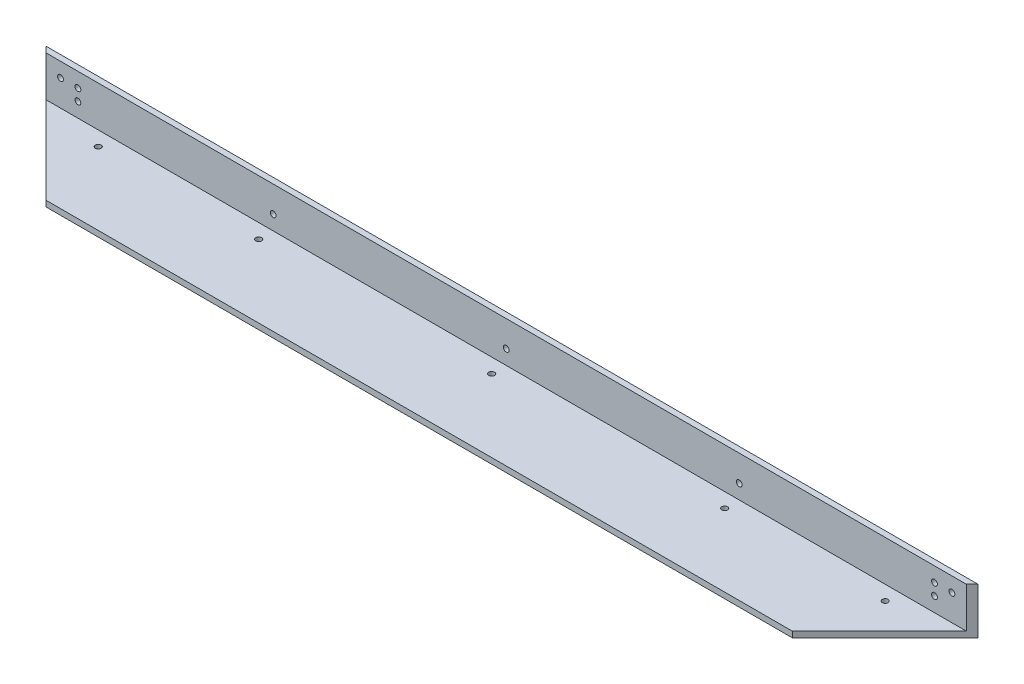
ISO-10303-21;
HEADER;
FILE_DESCRIPTION(('STEP AP214'),'2;1');
FILE_NAME('part.step','',(''),(''),'','','');
FILE_SCHEMA(('AUTOMOTIVE_DESIGN { 1 0 10303 214 1 1 1 1 }'));
ENDSEC;
DATA;
#1=APPLICATION_CONTEXT('core data for automotive mechanical design processes');
#2=APPLICATION_PROTOCOL_DEFINITION('international standard','automotive_design',2000,#1);
#3=PRODUCT_CONTEXT('',#1,'mechanical');
#4=PRODUCT('Part','Part','',(#3));
#5=PRODUCT_RELATED_PRODUCT_CATEGORY('part','',(#4));
#6=PRODUCT_DEFINITION_FORMATION('','',#4);
#7=PRODUCT_DEFINITION_CONTEXT('part definition',#1,'design');
#8=PRODUCT_DEFINITION('design','',#6,#7);
#9=PRODUCT_DEFINITION_SHAPE('','',#8);
#10=(LENGTH_UNIT() NAMED_UNIT(*) SI_UNIT(.MILLI.,.METRE.));
#11=(NAMED_UNIT(*) PLANE_ANGLE_UNIT() SI_UNIT($,.RADIAN.));
#12=(NAMED_UNIT(*) SI_UNIT($,.STERADIAN.) SOLID_ANGLE_UNIT());
#13=UNCERTAINTY_MEASURE_WITH_UNIT(LENGTH_MEASURE(1.E-05),#10,'distance_accuracy_value','');
#14=(GEOMETRIC_REPRESENTATION_CONTEXT(3) GLOBAL_UNCERTAINTY_ASSIGNED_CONTEXT((#13)) GLOBAL_UNIT_ASSIGNED_CONTEXT((#10,
#11,#12)) REPRESENTATION_CONTEXT('',''));
#15=CARTESIAN_POINT('',(0.,0.,0.));
#16=DIRECTION('',(0.,0.,1.));
#17=DIRECTION('',(1.,0.,0.));
#18=AXIS2_PLACEMENT_3D('',#15,#16,#17);
#19=CARTESIAN_POINT('',(510.,25.4,0.));
#20=DIRECTION('',(0.,0.,1.));
#21=DIRECTION('',(0.,-1.,0.));
#22=AXIS2_PLACEMENT_3D('',#19,#20,#21);
#23=PLANE('',#22);
#24=CARTESIAN_POINT('',(498.8875,17.4625,0.));
#25=DIRECTION('',(0.,0.,-1.));
#26=DIRECTION('',(0.,1.,0.));
#27=AXIS2_PLACEMENT_3D('',#24,#25,#26);
#28=CIRCLE('',#27,1.58750000000004);
#29=CARTESIAN_POINT('',(498.8875,19.05,0.));
#30=VERTEX_POINT('',#29);
#31=EDGE_CURVE('E153',#30,#30,#28,.T.);
#32=ORIENTED_EDGE('',*,*,#31,.F.);
#33=EDGE_LOOP('',(#32));
#34=FACE_BOUND('',#33,.T.);
#35=CARTESIAN_POINT('',(127.5,11.1125,0.));
#36=DIRECTION('',(0.,0.,-1.));
#37=DIRECTION('',(0.,1.,0.));
#38=AXIS2_PLACEMENT_3D('',#35,#36,#37);
#39=CIRCLE('',#38,1.58749999999999);
#40=CARTESIAN_POINT('',(127.5,12.7,0.));
#41=VERTEX_POINT('',#40);
#42=EDGE_CURVE('E332',#41,#41,#39,.T.);
#43=ORIENTED_EDGE('',*,*,#42,.F.);
#44=EDGE_LOOP('',(#43));
#45=FACE_BOUND('',#44,.T.);
#46=CARTESIAN_POINT('',(255.,11.1125,0.));
#47=DIRECTION('',(0.,0.,-1.));
#48=DIRECTION('',(0.,1.,0.));
#49=AXIS2_PLACEMENT_3D('',#46,#47,#48);
#50=CIRCLE('',#49,1.58750000000004);
#51=CARTESIAN_POINT('',(255.,12.7,0.));
#52=VERTEX_POINT('',#51);
#53=EDGE_CURVE('E335',#52,#52,#50,.T.);
#54=ORIENTED_EDGE('',*,*,#53,.F.);
#55=EDGE_LOOP('',(#54));
#56=FACE_BOUND('',#55,.T.);
#57=CARTESIAN_POINT('',(382.5,11.1125,0.));
#58=DIRECTION('',(0.,0.,-1.));
#59=DIRECTION('',(0.,1.,0.));
#60=AXIS2_PLACEMENT_3D('',#57,#58,#59);
#61=CIRCLE('',#60,1.58750000000004);
#62=CARTESIAN_POINT('',(382.5,12.7,0.));
#63=VERTEX_POINT('',#62);
#64=EDGE_CURVE('E338',#63,#63,#61,.T.);
#65=ORIENTED_EDGE('',*,*,#64,.F.);
#66=EDGE_LOOP('',(#65));
#67=FACE_BOUND('',#66,.T.);
#68=CARTESIAN_POINT('',(489.3625,11.1125,0.));
#69=DIRECTION('',(0.,0.,-1.));
#70=DIRECTION('',(0.,1.,0.));
#71=AXIS2_PLACEMENT_3D('',#68,#69,#70);
#72=CIRCLE('',#71,1.58749999999992);
#73=CARTESIAN_POINT('',(489.3625,12.6999999999999,0.));
#74=VERTEX_POINT('',#73);
#75=EDGE_CURVE('E330',#74,#74,#72,.T.);
#76=ORIENTED_EDGE('',*,*,#75,.F.);
#77=EDGE_LOOP('',(#76));
#78=FACE_BOUND('',#77,.T.);
#79=CARTESIAN_POINT('',(489.3625,17.4625,0.));
#80=DIRECTION('',(0.,0.,-1.));
#81=DIRECTION('',(0.,1.,0.));
#82=AXIS2_PLACEMENT_3D('',#79,#80,#81);
#83=CIRCLE('',#82,1.58749999999992);
#84=CARTESIAN_POINT('',(489.3625,19.0499999999999,0.));
#85=VERTEX_POINT('',#84);
#86=EDGE_CURVE('E317',#85,#85,#83,.T.);
#87=ORIENTED_EDGE('',*,*,#86,.F.);
#88=EDGE_LOOP('',(#87));
#89=FACE_BOUND('',#88,.T.);
#90=CARTESIAN_POINT('',(20.6375,17.4625,0.));
#91=DIRECTION('',(0.,0.,-1.));
#92=DIRECTION('',(0.,1.,0.));
#93=AXIS2_PLACEMENT_3D('',#90,#91,#92);
#94=CIRCLE('',#93,1.5875);
#95=CARTESIAN_POINT('',(20.6375,19.05,0.));
#96=VERTEX_POINT('',#95);
#97=EDGE_CURVE('E319',#96,#96,#94,.T.);
#98=ORIENTED_EDGE('',*,*,#97,.F.);
#99=EDGE_LOOP('',(#98));
#100=FACE_BOUND('',#99,.T.);
#101=CARTESIAN_POINT('',(11.1125,17.4625,0.));
#102=DIRECTION('',(0.,0.,-1.));
#103=DIRECTION('',(0.,1.,0.));
#104=AXIS2_PLACEMENT_3D('',#101,#102,#103);
#105=CIRCLE('',#104,1.5875);
#106=CARTESIAN_POINT('',(11.1125,19.05,0.));
#107=VERTEX_POINT('',#106);
#108=EDGE_CURVE('E324',#107,#107,#105,.T.);
#109=ORIENTED_EDGE('',*,*,#108,.F.);
#110=EDGE_LOOP('',(#109));
#111=FACE_BOUND('',#110,.T.);
#112=CARTESIAN_POINT('',(20.6375,11.1125,0.));
#113=DIRECTION('',(0.,0.,-1.));
#114=DIRECTION('',(0.,1.,0.));
#115=AXIS2_PLACEMENT_3D('',#112,#113,#114);
#116=CIRCLE('',#115,1.5875);
#117=CARTESIAN_POINT('',(20.6375,12.7,0.));
#118=VERTEX_POINT('',#117);
#119=EDGE_CURVE('E327',#118,#118,#116,.T.);
#120=ORIENTED_EDGE('',*,*,#119,.F.);
#121=EDGE_LOOP('',(#120));
#122=FACE_BOUND('',#121,.T.);
#123=DIRECTION('',(0.,1.,0.));
#124=VECTOR('',#123,1.);
#125=CARTESIAN_POINT('',(0.,25.4,0.));
#126=LINE('',#125,#124);
#127=CARTESIAN_POINT('',(0.,0.,0.));
#128=VERTEX_POINT('',#127);
#129=CARTESIAN_POINT('',(0.,25.4,0.));
#130=VERTEX_POINT('',#129);
#131=EDGE_CURVE('E113',#128,#130,#126,.T.);
#132=ORIENTED_EDGE('',*,*,#131,.T.);
#133=DIRECTION('',(-1.,0.,0.));
#134=VECTOR('',#133,1.);
#135=CARTESIAN_POINT('',(510.,25.4,0.));
#136=LINE('',#135,#134);
#137=CARTESIAN_POINT('',(510.,25.4,0.));
#138=VERTEX_POINT('',#137);
#139=EDGE_CURVE('E99',#138,#130,#136,.T.);
#140=ORIENTED_EDGE('',*,*,#139,.F.);
#141=DIRECTION('',(0.,1.,0.));
#142=VECTOR('',#141,1.);
#143=CARTESIAN_POINT('',(510.,25.4,0.));
#144=LINE('',#143,#142);
#145=CARTESIAN_POINT('',(510.,0.,0.));
#146=VERTEX_POINT('',#145);
#147=EDGE_CURVE('E111',#146,#138,#144,.T.);
#148=ORIENTED_EDGE('',*,*,#147,.F.);
#149=DIRECTION('',(-1.,0.,0.));
#150=VECTOR('',#149,1.);
#151=CARTESIAN_POINT('',(510.,0.,0.));
#152=LINE('',#151,#150);
#153=EDGE_CURVE('E120',#146,#128,#152,.T.);
#154=ORIENTED_EDGE('',*,*,#153,.T.);
#155=EDGE_LOOP('',(#132,#140,#148,#154));
#156=FACE_BOUND('',#155,.T.);
#157=ADVANCED_FACE('F42',(#34,#45,#56,#67,#78,#89,#100,#111,#122,#156),#23,.F.);
#158=CARTESIAN_POINT('',(510.,25.4,3.17499999999997));
#159=DIRECTION('',(0.,-1.,0.));
#160=DIRECTION('',(0.,0.,-1.));
#161=AXIS2_PLACEMENT_3D('',#158,#159,#160);
#162=PLANE('',#161);
#163=ORIENTED_EDGE('',*,*,#139,.T.);
#164=DIRECTION('',(0.707106781186546,0.,0.707106781186549));
#165=VECTOR('',#164,1.);
#166=CARTESIAN_POINT('',(50.8,25.3999999999999,50.8));
#167=LINE('',#166,#165);
#168=CARTESIAN_POINT('',(3.17500000000004,25.4,3.17499999999997));
#169=VERTEX_POINT('',#168);
#170=EDGE_CURVE('E67',#130,#169,#167,.T.);
#171=ORIENTED_EDGE('',*,*,#170,.T.);
#172=DIRECTION('',(-1.,0.,0.));
#173=VECTOR('',#172,1.);
#174=CARTESIAN_POINT('',(510.,25.4,3.17499999999997));
#175=LINE('',#174,#173);
#176=CARTESIAN_POINT('',(506.825,25.4,3.17499999999997));
#177=VERTEX_POINT('',#176);
#178=EDGE_CURVE('E101',#177,#169,#175,.T.);
#179=ORIENTED_EDGE('',*,*,#178,.F.);
#180=DIRECTION('',(-0.707106781186549,0.,0.707106781186546));
#181=VECTOR('',#180,1.);
#182=CARTESIAN_POINT('',(510.,25.4,0.));
#183=LINE('',#182,#181);
#184=EDGE_CURVE('E96',#177,#138,#183,.F.);
#185=ORIENTED_EDGE('',*,*,#184,.T.);
#186=EDGE_LOOP('',(#163,#171,#179,#185));
#187=FACE_BOUND('',#186,.T.);
#188=ADVANCED_FACE('F98',(#187),#162,.F.);
#189=CARTESIAN_POINT('',(510.,3.17499999999996,3.175));
#190=DIRECTION('',(0.,0.,-1.));
#191=DIRECTION('',(0.,1.,0.));
#192=AXIS2_PLACEMENT_3D('',#189,#190,#191);
#193=PLANE('',#192);
#194=CARTESIAN_POINT('',(498.8875,17.4625,3.17499999999998));
#195=DIRECTION('',(0.,0.,-1.));
#196=DIRECTION('',(0.,1.,0.));
#197=AXIS2_PLACEMENT_3D('',#194,#195,#196);
#198=CIRCLE('',#197,1.58750000000004);
#199=CARTESIAN_POINT('',(498.8875,19.0500000000001,3.17499999999998));
#200=VERTEX_POINT('',#199);
#201=EDGE_CURVE('E47',#200,#200,#198,.T.);
#202=ORIENTED_EDGE('',*,*,#201,.T.);
#203=EDGE_LOOP('',(#202));
#204=FACE_BOUND('',#203,.T.);
#205=CARTESIAN_POINT('',(127.5,11.1125,3.17499999999999));
#206=DIRECTION('',(0.,0.,-1.));
#207=DIRECTION('',(0.,1.,0.));
#208=AXIS2_PLACEMENT_3D('',#205,#206,#207);
#209=CIRCLE('',#208,1.58749999999999);
#210=CARTESIAN_POINT('',(127.5,12.7,3.17499999999999));
#211=VERTEX_POINT('',#210);
#212=EDGE_CURVE('E170',#211,#211,#209,.T.);
#213=ORIENTED_EDGE('',*,*,#212,.T.);
#214=EDGE_LOOP('',(#213));
#215=FACE_BOUND('',#214,.T.);
#216=CARTESIAN_POINT('',(255.,11.1125,3.17499999999999));
#217=DIRECTION('',(0.,0.,-1.));
#218=DIRECTION('',(0.,1.,0.));
#219=AXIS2_PLACEMENT_3D('',#216,#217,#218);
#220=CIRCLE('',#219,1.58750000000004);
#221=CARTESIAN_POINT('',(255.,12.7,3.17499999999999));
#222=VERTEX_POINT('',#221);
#223=EDGE_CURVE('E168',#222,#222,#220,.T.);
#224=ORIENTED_EDGE('',*,*,#223,.T.);
#225=EDGE_LOOP('',(#224));
#226=FACE_BOUND('',#225,.T.);
#227=CARTESIAN_POINT('',(382.5,11.1125,3.17499999999999));
#228=DIRECTION('',(0.,0.,-1.));
#229=DIRECTION('',(0.,1.,0.));
#230=AXIS2_PLACEMENT_3D('',#227,#228,#229);
#231=CIRCLE('',#230,1.58750000000004);
#232=CARTESIAN_POINT('',(382.5,12.7,3.17499999999999));
#233=VERTEX_POINT('',#232);
#234=EDGE_CURVE('E165',#233,#233,#231,.T.);
#235=ORIENTED_EDGE('',*,*,#234,.T.);
#236=EDGE_LOOP('',(#235));
#237=FACE_BOUND('',#236,.T.);
#238=CARTESIAN_POINT('',(489.3625,11.1125,3.17499999999999));
#239=DIRECTION('',(0.,0.,-1.));
#240=DIRECTION('',(0.,1.,0.));
#241=AXIS2_PLACEMENT_3D('',#238,#239,#240);
#242=CIRCLE('',#241,1.58749999999992);
#243=CARTESIAN_POINT('',(489.3625,12.6999999999999,3.17499999999999));
#244=VERTEX_POINT('',#243);
#245=EDGE_CURVE('E162',#244,#244,#242,.T.);
#246=ORIENTED_EDGE('',*,*,#245,.T.);
#247=EDGE_LOOP('',(#246));
#248=FACE_BOUND('',#247,.T.);
#249=CARTESIAN_POINT('',(489.3625,17.4625,3.17499999999998));
#250=DIRECTION('',(0.,0.,-1.));
#251=DIRECTION('',(0.,1.,0.));
#252=AXIS2_PLACEMENT_3D('',#249,#250,#251);
#253=CIRCLE('',#252,1.58749999999992);
#254=CARTESIAN_POINT('',(489.3625,19.0499999999999,3.17499999999998));
#255=VERTEX_POINT('',#254);
#256=EDGE_CURVE('E159',#255,#255,#253,.T.);
#257=ORIENTED_EDGE('',*,*,#256,.T.);
#258=EDGE_LOOP('',(#257));
#259=FACE_BOUND('',#258,.T.);
#260=CARTESIAN_POINT('',(20.6375,17.4625,3.17499999999998));
#261=DIRECTION('',(0.,0.,-1.));
#262=DIRECTION('',(0.,1.,0.));
#263=AXIS2_PLACEMENT_3D('',#260,#261,#262);
#264=CIRCLE('',#263,1.5875);
#265=CARTESIAN_POINT('',(20.6375,19.05,3.17499999999998));
#266=VERTEX_POINT('',#265);
#267=EDGE_CURVE('E156',#266,#266,#264,.T.);
#268=ORIENTED_EDGE('',*,*,#267,.T.);
#269=EDGE_LOOP('',(#268));
#270=FACE_BOUND('',#269,.T.);
#271=CARTESIAN_POINT('',(11.1125,17.4625,3.17499999999998));
#272=DIRECTION('',(0.,0.,-1.));
#273=DIRECTION('',(0.,1.,0.));
#274=AXIS2_PLACEMENT_3D('',#271,#272,#273);
#275=CIRCLE('',#274,1.5875);
#276=CARTESIAN_POINT('',(11.1125,19.05,3.17499999999998));
#277=VERTEX_POINT('',#276);
#278=EDGE_CURVE('E152',#277,#277,#275,.T.);
#279=ORIENTED_EDGE('',*,*,#278,.T.);
#280=EDGE_LOOP('',(#279));
#281=FACE_BOUND('',#280,.T.);
#282=CARTESIAN_POINT('',(20.6375,11.1125,3.17499999999999));
#283=DIRECTION('',(0.,0.,-1.));
#284=DIRECTION('',(0.,1.,0.));
#285=AXIS2_PLACEMENT_3D('',#282,#283,#284);
#286=CIRCLE('',#285,1.5875);
#287=CARTESIAN_POINT('',(20.6375,12.7,3.17499999999999));
#288=VERTEX_POINT('',#287);
#289=EDGE_CURVE('E149',#288,#288,#286,.T.);
#290=ORIENTED_EDGE('',*,*,#289,.T.);
#291=EDGE_LOOP('',(#290));
#292=FACE_BOUND('',#291,.T.);
#293=ORIENTED_EDGE('',*,*,#178,.T.);
#294=DIRECTION('',(0.,-1.,0.));
#295=VECTOR('',#294,1.);
#296=CARTESIAN_POINT('',(3.17500000000015,-1.48161216195721E-13,3.17500000000001));
#297=LINE('',#296,#295);
#298=CARTESIAN_POINT('',(3.17500000000015,3.17499999999996,3.175));
#299=VERTEX_POINT('',#298);
#300=EDGE_CURVE('E52',#169,#299,#297,.T.);
#301=ORIENTED_EDGE('',*,*,#300,.T.);
#302=DIRECTION('',(-1.,0.,0.));
#303=VECTOR('',#302,1.);
#304=CARTESIAN_POINT('',(510.,3.17499999999996,3.175));
#305=LINE('',#304,#303);
#306=CARTESIAN_POINT('',(506.825,3.17499999999996,3.175));
#307=VERTEX_POINT('',#306);
#308=EDGE_CURVE('E134',#307,#299,#305,.T.);
#309=ORIENTED_EDGE('',*,*,#308,.F.);
#310=DIRECTION('',(0.,-1.,0.));
#311=VECTOR('',#310,1.);
#312=CARTESIAN_POINT('',(506.825,0.,3.17500000000001));
#313=LINE('',#312,#311);
#314=EDGE_CURVE('E106',#307,#177,#313,.F.);
#315=ORIENTED_EDGE('',*,*,#314,.T.);
#316=EDGE_LOOP('',(#293,#301,#309,#315));
#317=FACE_BOUND('',#316,.T.);
#318=ADVANCED_FACE('F235',(#204,#215,#226,#237,#248,#259,#270,#281,#292,#317),#193,.F.);
#319=CARTESIAN_POINT('',(510.,3.17499999999996,50.8));
#320=DIRECTION('',(0.,-1.,0.));
#321=DIRECTION('',(0.,0.,-1.));
#322=AXIS2_PLACEMENT_3D('',#319,#320,#321);
#323=PLANE('',#322);
#324=CARTESIAN_POINT('',(39.6875,3.17499999999997,11.1125));
#325=DIRECTION('',(0.,-1.,0.));
#326=DIRECTION('',(0.,0.,-1.));
#327=AXIS2_PLACEMENT_3D('',#324,#325,#326);
#328=CIRCLE('',#327,1.5875);
#329=CARTESIAN_POINT('',(39.6875,3.17499999999997,9.525));
#330=VERTEX_POINT('',#329);
#331=EDGE_CURVE('E124',#330,#330,#328,.T.);
#332=ORIENTED_EDGE('',*,*,#331,.T.);
#333=EDGE_LOOP('',(#332));
#334=FACE_BOUND('',#333,.T.);
#335=CARTESIAN_POINT('',(382.5,3.17499999999997,11.1125));
#336=DIRECTION('',(0.,-1.,0.));
#337=DIRECTION('',(0.,0.,-1.));
#338=AXIS2_PLACEMENT_3D('',#335,#336,#337);
#339=CIRCLE('',#338,1.58750000000004);
#340=CARTESIAN_POINT('',(382.5,3.17499999999997,9.52499999999996));
#341=VERTEX_POINT('',#340);
#342=EDGE_CURVE('E202',#341,#341,#339,.T.);
#343=ORIENTED_EDGE('',*,*,#342,.T.);
#344=EDGE_LOOP('',(#343));
#345=FACE_BOUND('',#344,.T.);
#346=CARTESIAN_POINT('',(255.,3.17499999999997,11.1125));
#347=DIRECTION('',(0.,-1.,0.));
#348=DIRECTION('',(0.,0.,-1.));
#349=AXIS2_PLACEMENT_3D('',#346,#347,#348);
#350=CIRCLE('',#349,1.58750000000004);
#351=CARTESIAN_POINT('',(255.,3.17499999999997,9.52499999999996));
#352=VERTEX_POINT('',#351);
#353=EDGE_CURVE('E200',#352,#352,#350,.T.);
#354=ORIENTED_EDGE('',*,*,#353,.T.);
#355=EDGE_LOOP('',(#354));
#356=FACE_BOUND('',#355,.T.);
#357=CARTESIAN_POINT('',(127.5,3.17499999999997,11.1125));
#358=DIRECTION('',(0.,-1.,0.));
#359=DIRECTION('',(0.,0.,-1.));
#360=AXIS2_PLACEMENT_3D('',#357,#358,#359);
#361=CIRCLE('',#360,1.58749999999999);
#362=CARTESIAN_POINT('',(127.5,3.17499999999997,9.52500000000002));
#363=VERTEX_POINT('',#362);
#364=EDGE_CURVE('E197',#363,#363,#361,.T.);
#365=ORIENTED_EDGE('',*,*,#364,.T.);
#366=EDGE_LOOP('',(#365));
#367=FACE_BOUND('',#366,.T.);
#368=CARTESIAN_POINT('',(470.3125,3.17499999999997,11.1125));
#369=DIRECTION('',(0.,-1.,0.));
#370=DIRECTION('',(0.,0.,-1.));
#371=AXIS2_PLACEMENT_3D('',#368,#369,#370);
#372=CIRCLE('',#371,1.58750000000004);
#373=CARTESIAN_POINT('',(470.3125,3.17499999999997,9.52499999999996));
#374=VERTEX_POINT('',#373);
#375=EDGE_CURVE('E194',#374,#374,#372,.T.);
#376=ORIENTED_EDGE('',*,*,#375,.T.);
#377=EDGE_LOOP('',(#376));
#378=FACE_BOUND('',#377,.T.);
#379=ORIENTED_EDGE('',*,*,#308,.T.);
#380=DIRECTION('',(0.707106781186546,0.,0.707106781186549));
#381=VECTOR('',#380,1.);
#382=CARTESIAN_POINT('',(50.8,3.17499999999996,50.8));
#383=LINE('',#382,#381);
#384=CARTESIAN_POINT('',(50.8,3.17499999999996,50.8));
#385=VERTEX_POINT('',#384);
#386=EDGE_CURVE('E11',#299,#385,#383,.T.);
#387=ORIENTED_EDGE('',*,*,#386,.T.);
#388=DIRECTION('',(-1.,0.,0.));
#389=VECTOR('',#388,1.);
#390=CARTESIAN_POINT('',(510.,3.17499999999996,50.8));
#391=LINE('',#390,#389);
#392=CARTESIAN_POINT('',(459.2,3.17499999999996,50.8));
#393=VERTEX_POINT('',#392);
#394=EDGE_CURVE('E131',#393,#385,#391,.T.);
#395=ORIENTED_EDGE('',*,*,#394,.F.);
#396=DIRECTION('',(-0.707106781186549,0.,0.707106781186546));
#397=VECTOR('',#396,1.);
#398=CARTESIAN_POINT('',(510.,3.17499999999996,0.));
#399=LINE('',#398,#397);
#400=EDGE_CURVE('E140',#393,#307,#399,.F.);
#401=ORIENTED_EDGE('',*,*,#400,.T.);
#402=EDGE_LOOP('',(#379,#387,#395,#401));
#403=FACE_BOUND('',#402,.T.);
#404=ADVANCED_FACE('F209',(#334,#345,#356,#367,#378,#403),#323,.F.);
#405=CARTESIAN_POINT('',(510.,0.,50.8));
#406=DIRECTION('',(0.,0.,-1.));
#407=DIRECTION('',(-1.,0.,0.));
#408=AXIS2_PLACEMENT_3D('',#405,#406,#407);
#409=PLANE('',#408);
#410=ORIENTED_EDGE('',*,*,#394,.T.);
#411=DIRECTION('',(0.,-1.,0.));
#412=VECTOR('',#411,1.);
#413=CARTESIAN_POINT('',(50.8,0.,50.8));
#414=LINE('',#413,#412);
#415=CARTESIAN_POINT('',(50.8,0.,50.8));
#416=VERTEX_POINT('',#415);
#417=EDGE_CURVE('E105',#385,#416,#414,.T.);
#418=ORIENTED_EDGE('',*,*,#417,.T.);
#419=DIRECTION('',(-1.,0.,0.));
#420=VECTOR('',#419,1.);
#421=CARTESIAN_POINT('',(510.,0.,50.8));
#422=LINE('',#421,#420);
#423=CARTESIAN_POINT('',(459.2,0.,50.8));
#424=VERTEX_POINT('',#423);
#425=EDGE_CURVE('E122',#424,#416,#422,.T.);
#426=ORIENTED_EDGE('',*,*,#425,.F.);
#427=DIRECTION('',(0.,1.,0.));
#428=VECTOR('',#427,1.);
#429=CARTESIAN_POINT('',(459.2,0.,50.8));
#430=LINE('',#429,#428);
#431=EDGE_CURVE('E138',#424,#393,#430,.T.);
#432=ORIENTED_EDGE('',*,*,#431,.T.);
#433=EDGE_LOOP('',(#410,#418,#426,#432));
#434=FACE_BOUND('',#433,.T.);
#435=ADVANCED_FACE('F251',(#434),#409,.F.);
#436=CARTESIAN_POINT('',(510.,0.,0.));
#437=DIRECTION('',(0.,1.,0.));
#438=DIRECTION('',(0.,0.,1.));
#439=AXIS2_PLACEMENT_3D('',#436,#437,#438);
#440=PLANE('',#439);
#441=CARTESIAN_POINT('',(39.6875,0.,11.1125));
#442=DIRECTION('',(0.,-1.,0.));
#443=DIRECTION('',(0.,0.,-1.));
#444=AXIS2_PLACEMENT_3D('',#441,#442,#443);
#445=CIRCLE('',#444,1.5875);
#446=CARTESIAN_POINT('',(39.6875,0.,9.525));
#447=VERTEX_POINT('',#446);
#448=EDGE_CURVE('E191',#447,#447,#445,.T.);
#449=ORIENTED_EDGE('',*,*,#448,.F.);
#450=EDGE_LOOP('',(#449));
#451=FACE_BOUND('',#450,.T.);
#452=CARTESIAN_POINT('',(382.5,0.,11.1125));
#453=DIRECTION('',(0.,-1.,0.));
#454=DIRECTION('',(0.,0.,-1.));
#455=AXIS2_PLACEMENT_3D('',#452,#453,#454);
#456=CIRCLE('',#455,1.58750000000004);
#457=CARTESIAN_POINT('',(382.5,0.,9.52499999999996));
#458=VERTEX_POINT('',#457);
#459=EDGE_CURVE('E175',#458,#458,#456,.T.);
#460=ORIENTED_EDGE('',*,*,#459,.F.);
#461=EDGE_LOOP('',(#460));
#462=FACE_BOUND('',#461,.T.);
#463=CARTESIAN_POINT('',(255.,0.,11.1125));
#464=DIRECTION('',(0.,-1.,0.));
#465=DIRECTION('',(0.,0.,-1.));
#466=AXIS2_PLACEMENT_3D('',#463,#464,#465);
#467=CIRCLE('',#466,1.58750000000004);
#468=CARTESIAN_POINT('',(255.,0.,9.52499999999996));
#469=VERTEX_POINT('',#468);
#470=EDGE_CURVE('E179',#469,#469,#467,.T.);
#471=ORIENTED_EDGE('',*,*,#470,.F.);
#472=EDGE_LOOP('',(#471));
#473=FACE_BOUND('',#472,.T.);
#474=CARTESIAN_POINT('',(127.5,0.,11.1125));
#475=DIRECTION('',(0.,-1.,0.));
#476=DIRECTION('',(0.,0.,-1.));
#477=AXIS2_PLACEMENT_3D('',#474,#475,#476);
#478=CIRCLE('',#477,1.58749999999999);
#479=CARTESIAN_POINT('',(127.5,0.,9.52500000000002));
#480=VERTEX_POINT('',#479);
#481=EDGE_CURVE('E184',#480,#480,#478,.T.);
#482=ORIENTED_EDGE('',*,*,#481,.F.);
#483=EDGE_LOOP('',(#482));
#484=FACE_BOUND('',#483,.T.);
#485=CARTESIAN_POINT('',(470.3125,0.,11.1125));
#486=DIRECTION('',(0.,-1.,0.));
#487=DIRECTION('',(0.,0.,-1.));
#488=AXIS2_PLACEMENT_3D('',#485,#486,#487);
#489=CIRCLE('',#488,1.58750000000004);
#490=CARTESIAN_POINT('',(470.3125,0.,9.52499999999996));
#491=VERTEX_POINT('',#490);
#492=EDGE_CURVE('E188',#491,#491,#489,.T.);
#493=ORIENTED_EDGE('',*,*,#492,.F.);
#494=EDGE_LOOP('',(#493));
#495=FACE_BOUND('',#494,.T.);
#496=ORIENTED_EDGE('',*,*,#425,.T.);
#497=DIRECTION('',(-0.707106781186546,0.,-0.707106781186549));
#498=VECTOR('',#497,1.);
#499=CARTESIAN_POINT('',(50.8,0.,50.8));
#500=LINE('',#499,#498);
#501=EDGE_CURVE('E145',#416,#128,#500,.T.);
#502=ORIENTED_EDGE('',*,*,#501,.T.);
#503=ORIENTED_EDGE('',*,*,#153,.F.);
#504=DIRECTION('',(0.707106781186549,0.,-0.707106781186546));
#505=VECTOR('',#504,1.);
#506=CARTESIAN_POINT('',(510.,0.,0.));
#507=LINE('',#506,#505);
#508=EDGE_CURVE('E114',#146,#424,#507,.F.);
#509=ORIENTED_EDGE('',*,*,#508,.T.);
#510=EDGE_LOOP('',(#496,#502,#503,#509));
#511=FACE_BOUND('',#510,.T.);
#512=ADVANCED_FACE('F244',(#451,#462,#473,#484,#495,#511),#440,.F.);
#513=CARTESIAN_POINT('',(510.,0.,0.));
#514=DIRECTION('',(-0.707106781186546,0.,-0.707106781186549));
#515=DIRECTION('',(0.,-1.,0.));
#516=AXIS2_PLACEMENT_3D('',#513,#514,#515);
#517=PLANE('',#516);
#518=ORIENTED_EDGE('',*,*,#400,.F.);
#519=ORIENTED_EDGE('',*,*,#431,.F.);
#520=ORIENTED_EDGE('',*,*,#508,.F.);
#521=ORIENTED_EDGE('',*,*,#147,.T.);
#522=ORIENTED_EDGE('',*,*,#184,.F.);
#523=ORIENTED_EDGE('',*,*,#314,.F.);
#524=EDGE_LOOP('',(#518,#519,#520,#521,#522,#523));
#525=FACE_BOUND('',#524,.T.);
#526=ADVANCED_FACE('F117',(#525),#517,.F.);
#527=CARTESIAN_POINT('',(50.8,0.,50.8));
#528=DIRECTION('',(-0.707106781186549,0.,0.707106781186546));
#529=DIRECTION('',(0.,1.,0.));
#530=AXIS2_PLACEMENT_3D('',#527,#528,#529);
#531=PLANE('',#530);
#532=ORIENTED_EDGE('',*,*,#170,.F.);
#533=ORIENTED_EDGE('',*,*,#131,.F.);
#534=ORIENTED_EDGE('',*,*,#501,.F.);
#535=ORIENTED_EDGE('',*,*,#417,.F.);
#536=ORIENTED_EDGE('',*,*,#386,.F.);
#537=ORIENTED_EDGE('',*,*,#300,.F.);
#538=EDGE_LOOP('',(#532,#533,#534,#535,#536,#537));
#539=FACE_BOUND('',#538,.T.);
#540=ADVANCED_FACE('F45',(#539),#531,.T.);
#541=CARTESIAN_POINT('',(470.3125,25.4,11.1125));
#542=DIRECTION('',(0.,-1.,0.));
#543=DIRECTION('',(0.,0.,-1.));
#544=AXIS2_PLACEMENT_3D('',#541,#542,#543);
#545=CYLINDRICAL_SURFACE('',#544,1.58750000000004);
#546=ORIENTED_EDGE('',*,*,#492,.T.);
#547=EDGE_LOOP('',(#546));
#548=FACE_BOUND('',#547,.T.);
#549=ORIENTED_EDGE('',*,*,#375,.F.);
#550=EDGE_LOOP('',(#549));
#551=FACE_BOUND('',#550,.T.);
#552=ADVANCED_FACE('F249',(#548,#551),#545,.F.);
#553=CARTESIAN_POINT('',(127.5,25.4,11.1125));
#554=DIRECTION('',(0.,-1.,0.));
#555=DIRECTION('',(0.,0.,-1.));
#556=AXIS2_PLACEMENT_3D('',#553,#554,#555);
#557=CYLINDRICAL_SURFACE('',#556,1.58749999999999);
#558=ORIENTED_EDGE('',*,*,#481,.T.);
#559=EDGE_LOOP('',(#558));
#560=FACE_BOUND('',#559,.T.);
#561=ORIENTED_EDGE('',*,*,#364,.F.);
#562=EDGE_LOOP('',(#561));
#563=FACE_BOUND('',#562,.T.);
#564=ADVANCED_FACE('F262',(#560,#563),#557,.F.);
#565=CARTESIAN_POINT('',(255.,25.4,11.1125));
#566=DIRECTION('',(0.,-1.,0.));
#567=DIRECTION('',(0.,0.,-1.));
#568=AXIS2_PLACEMENT_3D('',#565,#566,#567);
#569=CYLINDRICAL_SURFACE('',#568,1.58750000000004);
#570=ORIENTED_EDGE('',*,*,#470,.T.);
#571=EDGE_LOOP('',(#570));
#572=FACE_BOUND('',#571,.T.);
#573=ORIENTED_EDGE('',*,*,#353,.F.);
#574=EDGE_LOOP('',(#573));
#575=FACE_BOUND('',#574,.T.);
#576=ADVANCED_FACE('F224',(#572,#575),#569,.F.);
#577=CARTESIAN_POINT('',(382.5,25.4,11.1125));
#578=DIRECTION('',(0.,-1.,0.));
#579=DIRECTION('',(0.,0.,-1.));
#580=AXIS2_PLACEMENT_3D('',#577,#578,#579);
#581=CYLINDRICAL_SURFACE('',#580,1.58750000000004);
#582=ORIENTED_EDGE('',*,*,#459,.T.);
#583=EDGE_LOOP('',(#582));
#584=FACE_BOUND('',#583,.T.);
#585=ORIENTED_EDGE('',*,*,#342,.F.);
#586=EDGE_LOOP('',(#585));
#587=FACE_BOUND('',#586,.T.);
#588=ADVANCED_FACE('F214',(#584,#587),#581,.F.);
#589=CARTESIAN_POINT('',(39.6875,25.4,11.1125));
#590=DIRECTION('',(0.,-1.,0.));
#591=DIRECTION('',(0.,0.,-1.));
#592=AXIS2_PLACEMENT_3D('',#589,#590,#591);
#593=CYLINDRICAL_SURFACE('',#592,1.5875);
#594=ORIENTED_EDGE('',*,*,#448,.T.);
#595=EDGE_LOOP('',(#594));
#596=FACE_BOUND('',#595,.T.);
#597=ORIENTED_EDGE('',*,*,#331,.F.);
#598=EDGE_LOOP('',(#597));
#599=FACE_BOUND('',#598,.T.);
#600=ADVANCED_FACE('F211',(#596,#599),#593,.F.);
#601=CARTESIAN_POINT('',(20.6375,11.1125,50.8));
#602=DIRECTION('',(0.,0.,-1.));
#603=DIRECTION('',(0.,1.,0.));
#604=AXIS2_PLACEMENT_3D('',#601,#602,#603);
#605=CYLINDRICAL_SURFACE('',#604,1.5875);
#606=ORIENTED_EDGE('',*,*,#119,.T.);
#607=EDGE_LOOP('',(#606));
#608=FACE_BOUND('',#607,.T.);
#609=ORIENTED_EDGE('',*,*,#289,.F.);
#610=EDGE_LOOP('',(#609));
#611=FACE_BOUND('',#610,.T.);
#612=ADVANCED_FACE('F213',(#608,#611),#605,.F.);
#613=CARTESIAN_POINT('',(11.1125,17.4625,50.8));
#614=DIRECTION('',(0.,0.,-1.));
#615=DIRECTION('',(0.,1.,0.));
#616=AXIS2_PLACEMENT_3D('',#613,#614,#615);
#617=CYLINDRICAL_SURFACE('',#616,1.5875);
#618=ORIENTED_EDGE('',*,*,#108,.T.);
#619=EDGE_LOOP('',(#618));
#620=FACE_BOUND('',#619,.T.);
#621=ORIENTED_EDGE('',*,*,#278,.F.);
#622=EDGE_LOOP('',(#621));
#623=FACE_BOUND('',#622,.T.);
#624=ADVANCED_FACE('F221',(#620,#623),#617,.F.);
#625=CARTESIAN_POINT('',(20.6375,17.4625,50.8));
#626=DIRECTION('',(0.,0.,-1.));
#627=DIRECTION('',(0.,1.,0.));
#628=AXIS2_PLACEMENT_3D('',#625,#626,#627);
#629=CYLINDRICAL_SURFACE('',#628,1.5875);
#630=ORIENTED_EDGE('',*,*,#97,.T.);
#631=EDGE_LOOP('',(#630));
#632=FACE_BOUND('',#631,.T.);
#633=ORIENTED_EDGE('',*,*,#267,.F.);
#634=EDGE_LOOP('',(#633));
#635=FACE_BOUND('',#634,.T.);
#636=ADVANCED_FACE('F292',(#632,#635),#629,.F.);
#637=CARTESIAN_POINT('',(489.3625,17.4625,50.8));
#638=DIRECTION('',(0.,0.,-1.));
#639=DIRECTION('',(0.,1.,0.));
#640=AXIS2_PLACEMENT_3D('',#637,#638,#639);
#641=CYLINDRICAL_SURFACE('',#640,1.58749999999992);
#642=ORIENTED_EDGE('',*,*,#86,.T.);
#643=EDGE_LOOP('',(#642));
#644=FACE_BOUND('',#643,.T.);
#645=ORIENTED_EDGE('',*,*,#256,.F.);
#646=EDGE_LOOP('',(#645));
#647=FACE_BOUND('',#646,.T.);
#648=ADVANCED_FACE('F298',(#644,#647),#641,.F.);
#649=CARTESIAN_POINT('',(489.3625,11.1125,50.8));
#650=DIRECTION('',(0.,0.,-1.));
#651=DIRECTION('',(0.,1.,0.));
#652=AXIS2_PLACEMENT_3D('',#649,#650,#651);
#653=CYLINDRICAL_SURFACE('',#652,1.58749999999992);
#654=ORIENTED_EDGE('',*,*,#75,.T.);
#655=EDGE_LOOP('',(#654));
#656=FACE_BOUND('',#655,.T.);
#657=ORIENTED_EDGE('',*,*,#245,.F.);
#658=EDGE_LOOP('',(#657));
#659=FACE_BOUND('',#658,.T.);
#660=ADVANCED_FACE('F306',(#656,#659),#653,.F.);
#661=CARTESIAN_POINT('',(382.5,11.1125,50.8));
#662=DIRECTION('',(0.,0.,-1.));
#663=DIRECTION('',(0.,1.,0.));
#664=AXIS2_PLACEMENT_3D('',#661,#662,#663);
#665=CYLINDRICAL_SURFACE('',#664,1.58750000000004);
#666=ORIENTED_EDGE('',*,*,#64,.T.);
#667=EDGE_LOOP('',(#666));
#668=FACE_BOUND('',#667,.T.);
#669=ORIENTED_EDGE('',*,*,#234,.F.);
#670=EDGE_LOOP('',(#669));
#671=FACE_BOUND('',#670,.T.);
#672=ADVANCED_FACE('F311',(#668,#671),#665,.F.);
#673=CARTESIAN_POINT('',(255.,11.1125,50.8));
#674=DIRECTION('',(0.,0.,-1.));
#675=DIRECTION('',(0.,1.,0.));
#676=AXIS2_PLACEMENT_3D('',#673,#674,#675);
#677=CYLINDRICAL_SURFACE('',#676,1.58750000000004);
#678=ORIENTED_EDGE('',*,*,#53,.T.);
#679=EDGE_LOOP('',(#678));
#680=FACE_BOUND('',#679,.T.);
#681=ORIENTED_EDGE('',*,*,#223,.F.);
#682=EDGE_LOOP('',(#681));
#683=FACE_BOUND('',#682,.T.);
#684=ADVANCED_FACE('F357',(#680,#683),#677,.F.);
#685=CARTESIAN_POINT('',(127.5,11.1125,50.8));
#686=DIRECTION('',(0.,0.,-1.));
#687=DIRECTION('',(0.,1.,0.));
#688=AXIS2_PLACEMENT_3D('',#685,#686,#687);
#689=CYLINDRICAL_SURFACE('',#688,1.58749999999999);
#690=ORIENTED_EDGE('',*,*,#42,.T.);
#691=EDGE_LOOP('',(#690));
#692=FACE_BOUND('',#691,.T.);
#693=ORIENTED_EDGE('',*,*,#212,.F.);
#694=EDGE_LOOP('',(#693));
#695=FACE_BOUND('',#694,.T.);
#696=ADVANCED_FACE('F302',(#692,#695),#689,.F.);
#697=CARTESIAN_POINT('',(498.8875,17.4625,50.8));
#698=DIRECTION('',(0.,0.,-1.));
#699=DIRECTION('',(0.,1.,0.));
#700=AXIS2_PLACEMENT_3D('',#697,#698,#699);
#701=CYLINDRICAL_SURFACE('',#700,1.58750000000004);
#702=ORIENTED_EDGE('',*,*,#31,.T.);
#703=EDGE_LOOP('',(#702));
#704=FACE_BOUND('',#703,.T.);
#705=ORIENTED_EDGE('',*,*,#201,.F.);
#706=EDGE_LOOP('',(#705));
#707=FACE_BOUND('',#706,.T.);
#708=ADVANCED_FACE('F364',(#704,#707),#701,.F.);
#709=CLOSED_SHELL('',(#157,#188,#318,#404,#435,#512,#526,#540,#552,#564,#576,#588,#600,#612,
#624,#636,#648,#660,#672,#684,#696,#708));
#710=MANIFOLD_SOLID_BREP('B2',#709);
#711=ADVANCED_BREP_SHAPE_REPRESENTATION('',(#18,#710),#14);
#712=SHAPE_DEFINITION_REPRESENTATION(#9,#711);
ENDSEC;
END-ISO-10303-21;
